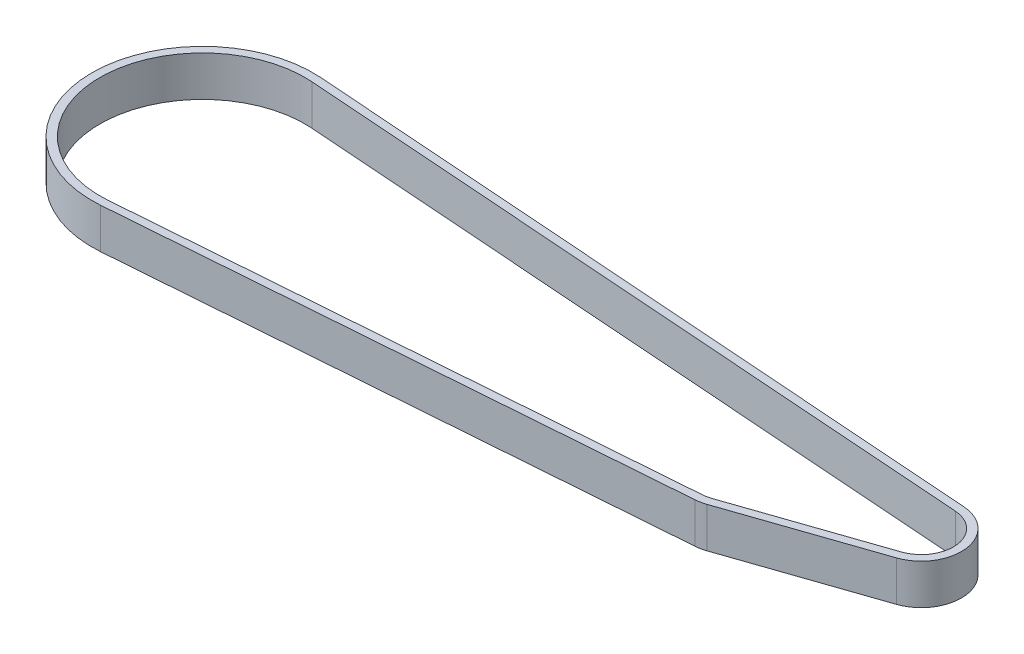
ISO-10303-21;
HEADER;
FILE_DESCRIPTION(('STEP AP214'),'2;1');
FILE_NAME('part.step','',(''),(''),'','','');
FILE_SCHEMA(('AUTOMOTIVE_DESIGN { 1 0 10303 214 1 1 1 1 }'));
ENDSEC;
DATA;
#1=APPLICATION_CONTEXT('core data for automotive mechanical design processes');
#2=APPLICATION_PROTOCOL_DEFINITION('international standard','automotive_design',2000,#1);
#3=PRODUCT_CONTEXT('',#1,'mechanical');
#4=PRODUCT('Part','Part','',(#3));
#5=PRODUCT_RELATED_PRODUCT_CATEGORY('part','',(#4));
#6=PRODUCT_DEFINITION_FORMATION('','',#4);
#7=PRODUCT_DEFINITION_CONTEXT('part definition',#1,'design');
#8=PRODUCT_DEFINITION('design','',#6,#7);
#9=PRODUCT_DEFINITION_SHAPE('','',#8);
#10=(LENGTH_UNIT() NAMED_UNIT(*) SI_UNIT(.MILLI.,.METRE.));
#11=(NAMED_UNIT(*) PLANE_ANGLE_UNIT() SI_UNIT($,.RADIAN.));
#12=(NAMED_UNIT(*) SI_UNIT($,.STERADIAN.) SOLID_ANGLE_UNIT());
#13=UNCERTAINTY_MEASURE_WITH_UNIT(LENGTH_MEASURE(1.E-05),#10,'distance_accuracy_value','');
#14=(GEOMETRIC_REPRESENTATION_CONTEXT(3) GLOBAL_UNCERTAINTY_ASSIGNED_CONTEXT((#13)) GLOBAL_UNIT_ASSIGNED_CONTEXT((#10,
#11,#12)) REPRESENTATION_CONTEXT('',''));
#15=CARTESIAN_POINT('',(0.,0.,0.));
#16=DIRECTION('',(0.,0.,1.));
#17=DIRECTION('',(1.,0.,0.));
#18=AXIS2_PLACEMENT_3D('',#15,#16,#17);
#19=CARTESIAN_POINT('',(-35.,5.,12.));
#20=DIRECTION('',(0.,1.,0.));
#21=DIRECTION('',(0.,0.,1.));
#22=AXIS2_PLACEMENT_3D('',#19,#20,#21);
#23=PLANE('',#22);
#24=CARTESIAN_POINT('',(-35.,5.,12.));
#25=DIRECTION('',(0.,1.,0.));
#26=DIRECTION('',(0.,0.,1.));
#27=AXIS2_PLACEMENT_3D('',#24,#25,#26);
#28=CIRCLE('',#27,9.96);
#29=CARTESIAN_POINT('',(-34.2427335270475,5.,21.9311704994397));
#30=VERTEX_POINT('',#29);
#31=CARTESIAN_POINT('',(-31.7697297297297,5.,21.4216216216216));
#32=VERTEX_POINT('',#31);
#33=EDGE_CURVE('E179',#30,#32,#28,.T.);
#34=ORIENTED_EDGE('',*,*,#33,.T.);
#35=DIRECTION('',(0.945945945945946,0.,-0.324324324324324));
#36=VECTOR('',#35,1.);
#37=CARTESIAN_POINT('',(3.23027027027027,5.,9.42162162162162));
#38=LINE('',#37,#36);
#39=CARTESIAN_POINT('',(3.23027027027027,5.,9.42162162162162));
#40=VERTEX_POINT('',#39);
#41=EDGE_CURVE('E182',#32,#40,#38,.T.);
#42=ORIENTED_EDGE('',*,*,#41,.T.);
#43=CARTESIAN_POINT('',(0.,5.,0.));
#44=DIRECTION('',(0.,1.,0.));
#45=DIRECTION('',(0.,0.,1.));
#46=AXIS2_PLACEMENT_3D('',#43,#44,#45);
#47=CIRCLE('',#46,9.96);
#48=CARTESIAN_POINT('',(0.718901978730338,5.,-9.9340213380573));
#49=VERTEX_POINT('',#48);
#50=EDGE_CURVE('E185',#40,#49,#47,.T.);
#51=ORIENTED_EDGE('',*,*,#50,.T.);
#52=DIRECTION('',(-0.997391700608162,0.,-0.0721789135271423));
#53=VECTOR('',#52,1.);
#54=CARTESIAN_POINT('',(0.718901978730338,5.,-9.9340213380573));
#55=LINE('',#54,#53);
#56=CARTESIAN_POINT('',(-171.517245245409,5.,-22.3983500157062));
#57=VERTEX_POINT('',#56);
#58=EDGE_CURVE('E187',#49,#57,#55,.T.);
#59=ORIENTED_EDGE('',*,*,#58,.T.);
#60=CARTESIAN_POINT('',(-173.5,5.,5.));
#61=DIRECTION('',(0.,1.,0.));
#62=DIRECTION('',(0.,0.,1.));
#63=AXIS2_PLACEMENT_3D('',#60,#61,#62);
#64=CIRCLE('',#63,27.47);
#65=CARTESIAN_POINT('',(-171.41143473775,5.,32.3904873112058));
#66=VERTEX_POINT('',#65);
#67=EDGE_CURVE('E189',#57,#66,#64,.T.);
#68=ORIENTED_EDGE('',*,*,#67,.T.);
#69=DIRECTION('',(0.997105471831299,0.,-0.0760307703767575));
#70=VECTOR('',#69,1.);
#71=CARTESIAN_POINT('',(-34.2427335270475,5.,21.9311704994397));
#72=LINE('',#71,#70);
#73=EDGE_CURVE('E191',#66,#30,#72,.T.);
#74=ORIENTED_EDGE('',*,*,#73,.T.);
#75=EDGE_LOOP('',(#34,#42,#51,#59,#68,#74));
#76=FACE_BOUND('',#75,.T.);
#77=DIRECTION('',(0.997105471831299,0.,-0.0760307703767575));
#78=VECTOR('',#77,1.);
#79=CARTESIAN_POINT('',(-34.394795067801,5.,19.9369595557771));
#80=LINE('',#79,#78);
#81=CARTESIAN_POINT('',(-171.563496278504,5.,30.3962763675432));
#82=VERTEX_POINT('',#81);
#83=CARTESIAN_POINT('',(-34.394795067801,5.,19.9369595557771));
#84=VERTEX_POINT('',#83);
#85=EDGE_CURVE('E136',#82,#84,#80,.T.);
#86=ORIENTED_EDGE('',*,*,#85,.F.);
#87=CARTESIAN_POINT('',(-173.5,5.,5.));
#88=DIRECTION('',(0.,1.,0.));
#89=DIRECTION('',(0.,0.,1.));
#90=AXIS2_PLACEMENT_3D('',#87,#88,#89);
#91=CIRCLE('',#90,25.47);
#92=CARTESIAN_POINT('',(-171.661603072464,5.,-20.4035666144899));
#93=VERTEX_POINT('',#92);
#94=EDGE_CURVE('E128',#93,#82,#91,.T.);
#95=ORIENTED_EDGE('',*,*,#94,.F.);
#96=DIRECTION('',(-0.997391700608162,0.,-0.0721789135271424));
#97=VECTOR('',#96,1.);
#98=CARTESIAN_POINT('',(0.574544151676053,5.,-7.93923793684097));
#99=LINE('',#98,#97);
#100=CARTESIAN_POINT('',(0.574544151676057,5.,-7.93923793684097));
#101=VERTEX_POINT('',#100);
#102=EDGE_CURVE('E157',#101,#93,#99,.T.);
#103=ORIENTED_EDGE('',*,*,#102,.F.);
#104=CARTESIAN_POINT('',(0.,5.,0.));
#105=DIRECTION('',(0.,1.,0.));
#106=DIRECTION('',(0.,0.,1.));
#107=AXIS2_PLACEMENT_3D('',#104,#105,#106);
#108=CIRCLE('',#107,7.96);
#109=CARTESIAN_POINT('',(2.58162162162162,5.,7.52972972972973));
#110=VERTEX_POINT('',#109);
#111=EDGE_CURVE('E155',#110,#101,#108,.T.);
#112=ORIENTED_EDGE('',*,*,#111,.F.);
#113=DIRECTION('',(0.945945945945946,0.,-0.324324324324324));
#114=VECTOR('',#113,1.);
#115=CARTESIAN_POINT('',(2.58162162162162,5.,7.52972972972973));
#116=LINE('',#115,#114);
#117=CARTESIAN_POINT('',(-32.4183783783784,5.,19.5297297297297));
#118=VERTEX_POINT('',#117);
#119=EDGE_CURVE('E151',#118,#110,#116,.T.);
#120=ORIENTED_EDGE('',*,*,#119,.F.);
#121=CARTESIAN_POINT('',(-35.,5.,12.));
#122=DIRECTION('',(0.,1.,0.));
#123=DIRECTION('',(0.,0.,1.));
#124=AXIS2_PLACEMENT_3D('',#121,#122,#123);
#125=CIRCLE('',#124,7.96);
#126=EDGE_CURVE('E149',#84,#118,#125,.T.);
#127=ORIENTED_EDGE('',*,*,#126,.F.);
#128=EDGE_LOOP('',(#86,#95,#103,#112,#120,#127));
#129=FACE_BOUND('',#128,.T.);
#130=ADVANCED_FACE('F39',(#76,#129),#23,.T.);
#131=CARTESIAN_POINT('',(-35.,-5.,12.));
#132=DIRECTION('',(0.,1.,0.));
#133=DIRECTION('',(0.,0.,1.));
#134=AXIS2_PLACEMENT_3D('',#131,#132,#133);
#135=PLANE('',#134);
#136=CARTESIAN_POINT('',(-35.,-5.,12.));
#137=DIRECTION('',(0.,1.,0.));
#138=DIRECTION('',(0.,0.,1.));
#139=AXIS2_PLACEMENT_3D('',#136,#137,#138);
#140=CIRCLE('',#139,9.96);
#141=CARTESIAN_POINT('',(-34.2427335270475,-5.,21.9311704994397));
#142=VERTEX_POINT('',#141);
#143=CARTESIAN_POINT('',(-31.7697297297297,-5.,21.4216216216216));
#144=VERTEX_POINT('',#143);
#145=EDGE_CURVE('E144',#142,#144,#140,.T.);
#146=ORIENTED_EDGE('',*,*,#145,.F.);
#147=DIRECTION('',(0.997105471831299,0.,-0.0760307703767575));
#148=VECTOR('',#147,1.);
#149=CARTESIAN_POINT('',(-34.2427335270475,-5.,21.9311704994397));
#150=LINE('',#149,#148);
#151=CARTESIAN_POINT('',(-171.41143473775,-5.,32.3904873112058));
#152=VERTEX_POINT('',#151);
#153=EDGE_CURVE('E183',#152,#142,#150,.T.);
#154=ORIENTED_EDGE('',*,*,#153,.F.);
#155=CARTESIAN_POINT('',(-173.5,-5.,5.));
#156=DIRECTION('',(0.,1.,0.));
#157=DIRECTION('',(0.,0.,1.));
#158=AXIS2_PLACEMENT_3D('',#155,#156,#157);
#159=CIRCLE('',#158,27.47);
#160=CARTESIAN_POINT('',(-171.517245245409,-5.,-22.3983500157062));
#161=VERTEX_POINT('',#160);
#162=EDGE_CURVE('E202',#161,#152,#159,.T.);
#163=ORIENTED_EDGE('',*,*,#162,.F.);
#164=DIRECTION('',(-0.997391700608162,0.,-0.0721789135271423));
#165=VECTOR('',#164,1.);
#166=CARTESIAN_POINT('',(0.718901978730338,-5.,-9.9340213380573));
#167=LINE('',#166,#165);
#168=CARTESIAN_POINT('',(0.718901978730338,-5.,-9.9340213380573));
#169=VERTEX_POINT('',#168);
#170=EDGE_CURVE('E200',#169,#161,#167,.T.);
#171=ORIENTED_EDGE('',*,*,#170,.F.);
#172=CARTESIAN_POINT('',(0.,-5.,0.));
#173=DIRECTION('',(0.,1.,0.));
#174=DIRECTION('',(0.,0.,1.));
#175=AXIS2_PLACEMENT_3D('',#172,#173,#174);
#176=CIRCLE('',#175,9.96);
#177=CARTESIAN_POINT('',(3.23027027027027,-5.,9.42162162162162));
#178=VERTEX_POINT('',#177);
#179=EDGE_CURVE('E198',#178,#169,#176,.T.);
#180=ORIENTED_EDGE('',*,*,#179,.F.);
#181=DIRECTION('',(0.945945945945946,0.,-0.324324324324324));
#182=VECTOR('',#181,1.);
#183=CARTESIAN_POINT('',(3.23027027027027,-5.,9.42162162162162));
#184=LINE('',#183,#182);
#185=EDGE_CURVE('E196',#144,#178,#184,.T.);
#186=ORIENTED_EDGE('',*,*,#185,.F.);
#187=EDGE_LOOP('',(#146,#154,#163,#171,#180,#186));
#188=FACE_BOUND('',#187,.T.);
#189=CARTESIAN_POINT('',(-173.5,-5.,5.));
#190=DIRECTION('',(0.,1.,0.));
#191=DIRECTION('',(0.,0.,1.));
#192=AXIS2_PLACEMENT_3D('',#189,#190,#191);
#193=CIRCLE('',#192,25.47);
#194=CARTESIAN_POINT('',(-171.661603072464,-5.,-20.4035666144899));
#195=VERTEX_POINT('',#194);
#196=CARTESIAN_POINT('',(-171.563496278504,-5.,30.3962763675432));
#197=VERTEX_POINT('',#196);
#198=EDGE_CURVE('E62',#195,#197,#193,.T.);
#199=ORIENTED_EDGE('',*,*,#198,.T.);
#200=DIRECTION('',(0.997105471831299,0.,-0.0760307703767575));
#201=VECTOR('',#200,1.);
#202=CARTESIAN_POINT('',(-34.394795067801,-5.,19.9369595557771));
#203=LINE('',#202,#201);
#204=CARTESIAN_POINT('',(-34.394795067801,-5.,19.9369595557771));
#205=VERTEX_POINT('',#204);
#206=EDGE_CURVE('E143',#197,#205,#203,.T.);
#207=ORIENTED_EDGE('',*,*,#206,.T.);
#208=CARTESIAN_POINT('',(-35.,-5.,12.));
#209=DIRECTION('',(0.,1.,0.));
#210=DIRECTION('',(0.,0.,1.));
#211=AXIS2_PLACEMENT_3D('',#208,#209,#210);
#212=CIRCLE('',#211,7.96);
#213=CARTESIAN_POINT('',(-32.4183783783784,-5.,19.5297297297297));
#214=VERTEX_POINT('',#213);
#215=EDGE_CURVE('E161',#205,#214,#212,.T.);
#216=ORIENTED_EDGE('',*,*,#215,.T.);
#217=DIRECTION('',(0.945945945945946,0.,-0.324324324324324));
#218=VECTOR('',#217,1.);
#219=CARTESIAN_POINT('',(2.58162162162162,-5.,7.52972972972973));
#220=LINE('',#219,#218);
#221=CARTESIAN_POINT('',(2.58162162162162,-5.,7.52972972972973));
#222=VERTEX_POINT('',#221);
#223=EDGE_CURVE('E164',#214,#222,#220,.T.);
#224=ORIENTED_EDGE('',*,*,#223,.T.);
#225=CARTESIAN_POINT('',(0.,-5.,0.));
#226=DIRECTION('',(0.,1.,0.));
#227=DIRECTION('',(0.,0.,1.));
#228=AXIS2_PLACEMENT_3D('',#225,#226,#227);
#229=CIRCLE('',#228,7.96);
#230=CARTESIAN_POINT('',(0.574544151676053,-5.,-7.93923793684097));
#231=VERTEX_POINT('',#230);
#232=EDGE_CURVE('E167',#222,#231,#229,.T.);
#233=ORIENTED_EDGE('',*,*,#232,.T.);
#234=DIRECTION('',(-0.997391700608162,0.,-0.0721789135271424));
#235=VECTOR('',#234,1.);
#236=CARTESIAN_POINT('',(0.574544151676053,-5.,-7.93923793684097));
#237=LINE('',#236,#235);
#238=EDGE_CURVE('E137',#231,#195,#237,.T.);
#239=ORIENTED_EDGE('',*,*,#238,.T.);
#240=EDGE_LOOP('',(#199,#207,#216,#224,#233,#239));
#241=FACE_BOUND('',#240,.T.);
#242=ADVANCED_FACE('F226',(#188,#241),#135,.F.);
#243=CARTESIAN_POINT('',(-35.,5.,12.));
#244=DIRECTION('',(0.,-1.,0.));
#245=DIRECTION('',(0.,0.,-1.));
#246=AXIS2_PLACEMENT_3D('',#243,#244,#245);
#247=CYLINDRICAL_SURFACE('',#246,9.96);
#248=ORIENTED_EDGE('',*,*,#145,.T.);
#249=DIRECTION('',(0.,-1.,0.));
#250=VECTOR('',#249,1.);
#251=CARTESIAN_POINT('',(-31.7697297297297,5.,21.4216216216216));
#252=LINE('',#251,#250);
#253=EDGE_CURVE('E11',#32,#144,#252,.T.);
#254=ORIENTED_EDGE('',*,*,#253,.F.);
#255=ORIENTED_EDGE('',*,*,#33,.F.);
#256=DIRECTION('',(0.,-1.,0.));
#257=VECTOR('',#256,1.);
#258=CARTESIAN_POINT('',(-34.2427335270475,5.,21.9311704994397));
#259=LINE('',#258,#257);
#260=EDGE_CURVE('E193',#30,#142,#259,.T.);
#261=ORIENTED_EDGE('',*,*,#260,.T.);
#262=EDGE_LOOP('',(#248,#254,#255,#261));
#263=FACE_BOUND('',#262,.T.);
#264=ADVANCED_FACE('F41',(#263),#247,.T.);
#265=CARTESIAN_POINT('',(3.23027027027027,5.,9.42162162162162));
#266=DIRECTION('',(-0.324324324324324,0.,-0.945945945945946));
#267=DIRECTION('',(-0.945945945945946,0.,0.324324324324324));
#268=AXIS2_PLACEMENT_3D('',#265,#266,#267);
#269=PLANE('',#268);
#270=ORIENTED_EDGE('',*,*,#185,.T.);
#271=DIRECTION('',(0.,-1.,0.));
#272=VECTOR('',#271,1.);
#273=CARTESIAN_POINT('',(3.23027027027027,5.,9.42162162162162));
#274=LINE('',#273,#272);
#275=EDGE_CURVE('E47',#40,#178,#274,.T.);
#276=ORIENTED_EDGE('',*,*,#275,.F.);
#277=ORIENTED_EDGE('',*,*,#41,.F.);
#278=ORIENTED_EDGE('',*,*,#253,.T.);
#279=EDGE_LOOP('',(#270,#276,#277,#278));
#280=FACE_BOUND('',#279,.T.);
#281=ADVANCED_FACE('F243',(#280),#269,.F.);
#282=CARTESIAN_POINT('',(0.,5.,0.));
#283=DIRECTION('',(0.,-1.,0.));
#284=DIRECTION('',(0.,0.,-1.));
#285=AXIS2_PLACEMENT_3D('',#282,#283,#284);
#286=CYLINDRICAL_SURFACE('',#285,9.96);
#287=ORIENTED_EDGE('',*,*,#179,.T.);
#288=DIRECTION('',(0.,-1.,0.));
#289=VECTOR('',#288,1.);
#290=CARTESIAN_POINT('',(0.718901978730338,5.,-9.9340213380573));
#291=LINE('',#290,#289);
#292=EDGE_CURVE('E213',#49,#169,#291,.T.);
#293=ORIENTED_EDGE('',*,*,#292,.F.);
#294=ORIENTED_EDGE('',*,*,#50,.F.);
#295=ORIENTED_EDGE('',*,*,#275,.T.);
#296=EDGE_LOOP('',(#287,#293,#294,#295));
#297=FACE_BOUND('',#296,.T.);
#298=ADVANCED_FACE('F220',(#297),#286,.T.);
#299=CARTESIAN_POINT('',(0.718901978730338,5.,-9.9340213380573));
#300=DIRECTION('',(-0.0721789135271423,0.,0.997391700608162));
#301=DIRECTION('',(0.997391700608162,0.,0.0721789135271423));
#302=AXIS2_PLACEMENT_3D('',#299,#300,#301);
#303=PLANE('',#302);
#304=ORIENTED_EDGE('',*,*,#170,.T.);
#305=DIRECTION('',(0.,-1.,0.));
#306=VECTOR('',#305,1.);
#307=CARTESIAN_POINT('',(-171.517245245409,5.,-22.3983500157062));
#308=LINE('',#307,#306);
#309=EDGE_CURVE('E210',#57,#161,#308,.T.);
#310=ORIENTED_EDGE('',*,*,#309,.F.);
#311=ORIENTED_EDGE('',*,*,#58,.F.);
#312=ORIENTED_EDGE('',*,*,#292,.T.);
#313=EDGE_LOOP('',(#304,#310,#311,#312));
#314=FACE_BOUND('',#313,.T.);
#315=ADVANCED_FACE('F232',(#314),#303,.F.);
#316=CARTESIAN_POINT('',(-173.5,5.,5.));
#317=DIRECTION('',(0.,-1.,0.));
#318=DIRECTION('',(0.,0.,-1.));
#319=AXIS2_PLACEMENT_3D('',#316,#317,#318);
#320=CYLINDRICAL_SURFACE('',#319,27.47);
#321=ORIENTED_EDGE('',*,*,#162,.T.);
#322=DIRECTION('',(0.,-1.,0.));
#323=VECTOR('',#322,1.);
#324=CARTESIAN_POINT('',(-171.41143473775,5.,32.3904873112058));
#325=LINE('',#324,#323);
#326=EDGE_CURVE('E207',#66,#152,#325,.T.);
#327=ORIENTED_EDGE('',*,*,#326,.F.);
#328=ORIENTED_EDGE('',*,*,#67,.F.);
#329=ORIENTED_EDGE('',*,*,#309,.T.);
#330=EDGE_LOOP('',(#321,#327,#328,#329));
#331=FACE_BOUND('',#330,.T.);
#332=ADVANCED_FACE('F236',(#331),#320,.T.);
#333=CARTESIAN_POINT('',(-34.2427335270475,5.,21.9311704994397));
#334=DIRECTION('',(-0.0760307703767575,0.,-0.997105471831299));
#335=DIRECTION('',(-0.997105471831299,0.,0.0760307703767575));
#336=AXIS2_PLACEMENT_3D('',#333,#334,#335);
#337=PLANE('',#336);
#338=ORIENTED_EDGE('',*,*,#153,.T.);
#339=ORIENTED_EDGE('',*,*,#260,.F.);
#340=ORIENTED_EDGE('',*,*,#73,.F.);
#341=ORIENTED_EDGE('',*,*,#326,.T.);
#342=EDGE_LOOP('',(#338,#339,#340,#341));
#343=FACE_BOUND('',#342,.T.);
#344=ADVANCED_FACE('F246',(#343),#337,.F.);
#345=CARTESIAN_POINT('',(-173.5,5.,5.));
#346=DIRECTION('',(0.,-1.,0.));
#347=DIRECTION('',(0.,0.,-1.));
#348=AXIS2_PLACEMENT_3D('',#345,#346,#347);
#349=CYLINDRICAL_SURFACE('',#348,25.47);
#350=ORIENTED_EDGE('',*,*,#198,.F.);
#351=DIRECTION('',(0.,-1.,0.));
#352=VECTOR('',#351,1.);
#353=CARTESIAN_POINT('',(-171.661603072464,5.,-20.4035666144899));
#354=LINE('',#353,#352);
#355=EDGE_CURVE('E132',#93,#195,#354,.T.);
#356=ORIENTED_EDGE('',*,*,#355,.F.);
#357=ORIENTED_EDGE('',*,*,#94,.T.);
#358=DIRECTION('',(0.,-1.,0.));
#359=VECTOR('',#358,1.);
#360=CARTESIAN_POINT('',(-171.563496278504,5.,30.3962763675432));
#361=LINE('',#360,#359);
#362=EDGE_CURVE('E131',#82,#197,#361,.T.);
#363=ORIENTED_EDGE('',*,*,#362,.T.);
#364=EDGE_LOOP('',(#350,#356,#357,#363));
#365=FACE_BOUND('',#364,.T.);
#366=ADVANCED_FACE('F130',(#365),#349,.F.);
#367=CARTESIAN_POINT('',(-34.394795067801,5.,19.9369595557771));
#368=DIRECTION('',(-0.0760307703767575,0.,-0.997105471831299));
#369=DIRECTION('',(-0.997105471831299,0.,0.0760307703767575));
#370=AXIS2_PLACEMENT_3D('',#367,#368,#369);
#371=PLANE('',#370);
#372=ORIENTED_EDGE('',*,*,#206,.F.);
#373=ORIENTED_EDGE('',*,*,#362,.F.);
#374=ORIENTED_EDGE('',*,*,#85,.T.);
#375=DIRECTION('',(0.,-1.,0.));
#376=VECTOR('',#375,1.);
#377=CARTESIAN_POINT('',(-34.394795067801,5.,19.9369595557771));
#378=LINE('',#377,#376);
#379=EDGE_CURVE('E145',#84,#205,#378,.T.);
#380=ORIENTED_EDGE('',*,*,#379,.T.);
#381=EDGE_LOOP('',(#372,#373,#374,#380));
#382=FACE_BOUND('',#381,.T.);
#383=ADVANCED_FACE('F140',(#382),#371,.T.);
#384=CARTESIAN_POINT('',(-35.,5.,12.));
#385=DIRECTION('',(0.,-1.,0.));
#386=DIRECTION('',(0.,0.,-1.));
#387=AXIS2_PLACEMENT_3D('',#384,#385,#386);
#388=CYLINDRICAL_SURFACE('',#387,7.96);
#389=ORIENTED_EDGE('',*,*,#215,.F.);
#390=ORIENTED_EDGE('',*,*,#379,.F.);
#391=ORIENTED_EDGE('',*,*,#126,.T.);
#392=DIRECTION('',(0.,-1.,0.));
#393=VECTOR('',#392,1.);
#394=CARTESIAN_POINT('',(-32.4183783783784,5.,19.5297297297297));
#395=LINE('',#394,#393);
#396=EDGE_CURVE('E176',#118,#214,#395,.T.);
#397=ORIENTED_EDGE('',*,*,#396,.T.);
#398=EDGE_LOOP('',(#389,#390,#391,#397));
#399=FACE_BOUND('',#398,.T.);
#400=ADVANCED_FACE('F264',(#399),#388,.F.);
#401=CARTESIAN_POINT('',(2.58162162162162,5.,7.52972972972973));
#402=DIRECTION('',(-0.324324324324324,0.,-0.945945945945946));
#403=DIRECTION('',(-0.945945945945946,0.,0.324324324324324));
#404=AXIS2_PLACEMENT_3D('',#401,#402,#403);
#405=PLANE('',#404);
#406=ORIENTED_EDGE('',*,*,#223,.F.);
#407=ORIENTED_EDGE('',*,*,#396,.F.);
#408=ORIENTED_EDGE('',*,*,#119,.T.);
#409=DIRECTION('',(0.,-1.,0.));
#410=VECTOR('',#409,1.);
#411=CARTESIAN_POINT('',(2.58162162162162,5.,7.52972972972973));
#412=LINE('',#411,#410);
#413=EDGE_CURVE('E174',#110,#222,#412,.T.);
#414=ORIENTED_EDGE('',*,*,#413,.T.);
#415=EDGE_LOOP('',(#406,#407,#408,#414));
#416=FACE_BOUND('',#415,.T.);
#417=ADVANCED_FACE('F267',(#416),#405,.T.);
#418=CARTESIAN_POINT('',(0.,5.,0.));
#419=DIRECTION('',(0.,-1.,0.));
#420=DIRECTION('',(0.,0.,-1.));
#421=AXIS2_PLACEMENT_3D('',#418,#419,#420);
#422=CYLINDRICAL_SURFACE('',#421,7.96);
#423=ORIENTED_EDGE('',*,*,#232,.F.);
#424=ORIENTED_EDGE('',*,*,#413,.F.);
#425=ORIENTED_EDGE('',*,*,#111,.T.);
#426=DIRECTION('',(0.,-1.,0.));
#427=VECTOR('',#426,1.);
#428=CARTESIAN_POINT('',(0.574544151676053,5.,-7.93923793684097));
#429=LINE('',#428,#427);
#430=EDGE_CURVE('E54',#101,#231,#429,.T.);
#431=ORIENTED_EDGE('',*,*,#430,.T.);
#432=EDGE_LOOP('',(#423,#424,#425,#431));
#433=FACE_BOUND('',#432,.T.);
#434=ADVANCED_FACE('F271',(#433),#422,.F.);
#435=CARTESIAN_POINT('',(0.574544151676053,5.,-7.93923793684097));
#436=DIRECTION('',(-0.0721789135271424,0.,0.997391700608162));
#437=DIRECTION('',(0.997391700608162,0.,0.0721789135271424));
#438=AXIS2_PLACEMENT_3D('',#435,#436,#437);
#439=PLANE('',#438);
#440=ORIENTED_EDGE('',*,*,#238,.F.);
#441=ORIENTED_EDGE('',*,*,#430,.F.);
#442=ORIENTED_EDGE('',*,*,#102,.T.);
#443=ORIENTED_EDGE('',*,*,#355,.T.);
#444=EDGE_LOOP('',(#440,#441,#442,#443));
#445=FACE_BOUND('',#444,.T.);
#446=ADVANCED_FACE('F275',(#445),#439,.T.);
#447=CLOSED_SHELL('',(#130,#242,#264,#281,#298,#315,#332,#344,#366,#383,#400,#417,#434,#446));
#448=MANIFOLD_SOLID_BREP('B2',#447);
#449=ADVANCED_BREP_SHAPE_REPRESENTATION('',(#18,#448),#14);
#450=SHAPE_DEFINITION_REPRESENTATION(#9,#449);
ENDSEC;
END-ISO-10303-21;
